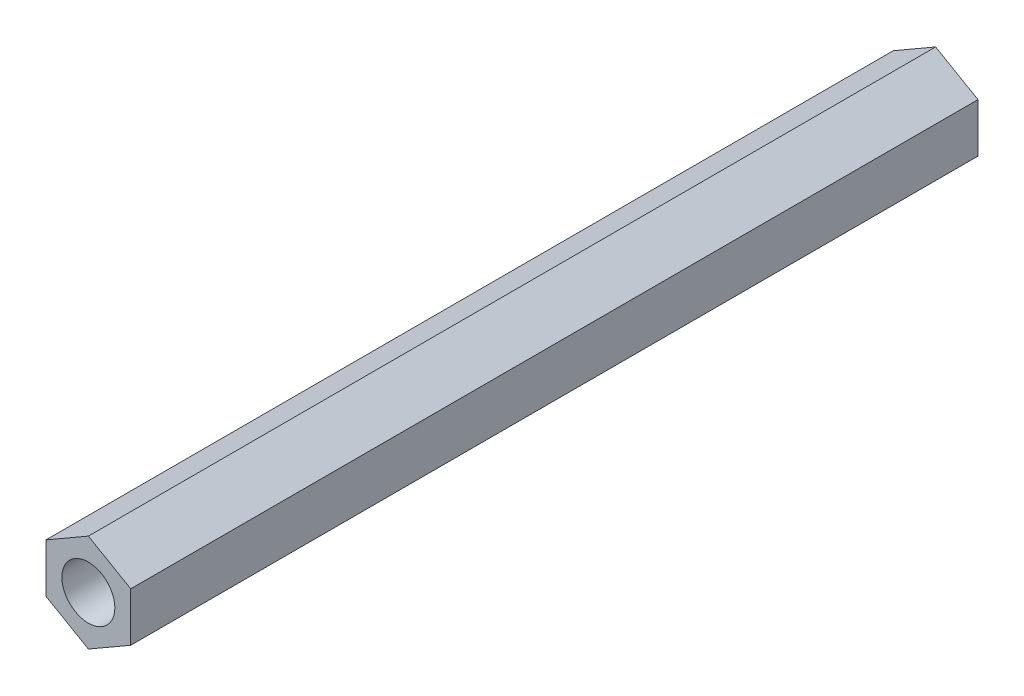
ISO-10303-21;
HEADER;
FILE_DESCRIPTION(('STEP AP214'),'2;1');
FILE_NAME('part.step','',(''),(''),'','','');
FILE_SCHEMA(('AUTOMOTIVE_DESIGN { 1 0 10303 214 1 1 1 1 }'));
ENDSEC;
DATA;
#1=APPLICATION_CONTEXT('core data for automotive mechanical design processes');
#2=APPLICATION_PROTOCOL_DEFINITION('international standard','automotive_design',2000,#1);
#3=PRODUCT_CONTEXT('',#1,'mechanical');
#4=PRODUCT('Part','Part','',(#3));
#5=PRODUCT_RELATED_PRODUCT_CATEGORY('part','',(#4));
#6=PRODUCT_DEFINITION_FORMATION('','',#4);
#7=PRODUCT_DEFINITION_CONTEXT('part definition',#1,'design');
#8=PRODUCT_DEFINITION('design','',#6,#7);
#9=PRODUCT_DEFINITION_SHAPE('','',#8);
#10=(LENGTH_UNIT() NAMED_UNIT(*) SI_UNIT(.MILLI.,.METRE.));
#11=(NAMED_UNIT(*) PLANE_ANGLE_UNIT() SI_UNIT($,.RADIAN.));
#12=(NAMED_UNIT(*) SI_UNIT($,.STERADIAN.) SOLID_ANGLE_UNIT());
#13=UNCERTAINTY_MEASURE_WITH_UNIT(LENGTH_MEASURE(1.E-05),#10,'distance_accuracy_value','');
#14=(GEOMETRIC_REPRESENTATION_CONTEXT(3) GLOBAL_UNCERTAINTY_ASSIGNED_CONTEXT((#13)) GLOBAL_UNIT_ASSIGNED_CONTEXT((#10,
#11,#12)) REPRESENTATION_CONTEXT('',''));
#15=CARTESIAN_POINT('',(0.,0.,0.));
#16=DIRECTION('',(0.,0.,1.));
#17=DIRECTION('',(1.,0.,0.));
#18=AXIS2_PLACEMENT_3D('',#15,#16,#17);
#19=CARTESIAN_POINT('',(0.,-4.61880215351701,80.));
#20=DIRECTION('',(-0.5,0.866025403784438,0.));
#21=DIRECTION('',(-0.866025403784438,-0.5,0.));
#22=AXIS2_PLACEMENT_3D('',#19,#20,#21);
#23=PLANE('',#22);
#24=DIRECTION('',(0.866025403784439,0.5,0.));
#25=VECTOR('',#24,1.);
#26=CARTESIAN_POINT('',(0.,-4.61880215351701,0.));
#27=LINE('',#26,#25);
#28=CARTESIAN_POINT('',(0.,-4.61880215351701,0.));
#29=VERTEX_POINT('',#28);
#30=CARTESIAN_POINT('',(4.,-2.3094010767585,0.));
#31=VERTEX_POINT('',#30);
#32=EDGE_CURVE('E127',#29,#31,#27,.T.);
#33=ORIENTED_EDGE('',*,*,#32,.T.);
#34=DIRECTION('',(0.,0.,-1.));
#35=VECTOR('',#34,1.);
#36=CARTESIAN_POINT('',(4.,-2.3094010767585,80.));
#37=LINE('',#36,#35);
#38=CARTESIAN_POINT('',(4.,-2.3094010767585,80.));
#39=VERTEX_POINT('',#38);
#40=EDGE_CURVE('E11',#39,#31,#37,.T.);
#41=ORIENTED_EDGE('',*,*,#40,.F.);
#42=DIRECTION('',(0.866025403784439,0.5,0.));
#43=VECTOR('',#42,1.);
#44=CARTESIAN_POINT('',(0.,-4.61880215351701,80.));
#45=LINE('',#44,#43);
#46=CARTESIAN_POINT('',(0.,-4.61880215351701,80.));
#47=VERTEX_POINT('',#46);
#48=EDGE_CURVE('E138',#47,#39,#45,.T.);
#49=ORIENTED_EDGE('',*,*,#48,.F.);
#50=DIRECTION('',(0.,0.,-1.));
#51=VECTOR('',#50,1.);
#52=CARTESIAN_POINT('',(0.,-4.61880215351701,80.));
#53=LINE('',#52,#51);
#54=EDGE_CURVE('E123',#47,#29,#53,.T.);
#55=ORIENTED_EDGE('',*,*,#54,.T.);
#56=EDGE_LOOP('',(#33,#41,#49,#55));
#57=FACE_BOUND('',#56,.T.);
#58=ADVANCED_FACE('F43',(#57),#23,.F.);
#59=CARTESIAN_POINT('',(4.,-2.3094010767585,80.));
#60=DIRECTION('',(-1.,0.,0.));
#61=DIRECTION('',(0.,-1.,0.));
#62=AXIS2_PLACEMENT_3D('',#59,#60,#61);
#63=PLANE('',#62);
#64=DIRECTION('',(0.,1.,0.));
#65=VECTOR('',#64,1.);
#66=CARTESIAN_POINT('',(4.,-2.3094010767585,0.));
#67=LINE('',#66,#65);
#68=CARTESIAN_POINT('',(4.,2.3094010767585,0.));
#69=VERTEX_POINT('',#68);
#70=EDGE_CURVE('E130',#31,#69,#67,.T.);
#71=ORIENTED_EDGE('',*,*,#70,.T.);
#72=DIRECTION('',(0.,0.,-1.));
#73=VECTOR('',#72,1.);
#74=CARTESIAN_POINT('',(4.,2.3094010767585,80.));
#75=LINE('',#74,#73);
#76=CARTESIAN_POINT('',(4.,2.3094010767585,80.));
#77=VERTEX_POINT('',#76);
#78=EDGE_CURVE('E51',#77,#69,#75,.T.);
#79=ORIENTED_EDGE('',*,*,#78,.F.);
#80=DIRECTION('',(0.,1.,0.));
#81=VECTOR('',#80,1.);
#82=CARTESIAN_POINT('',(4.,-2.3094010767585,80.));
#83=LINE('',#82,#81);
#84=EDGE_CURVE('E96',#39,#77,#83,.T.);
#85=ORIENTED_EDGE('',*,*,#84,.F.);
#86=ORIENTED_EDGE('',*,*,#40,.T.);
#87=EDGE_LOOP('',(#71,#79,#85,#86));
#88=FACE_BOUND('',#87,.T.);
#89=ADVANCED_FACE('F163',(#88),#63,.F.);
#90=CARTESIAN_POINT('',(4.,2.3094010767585,80.));
#91=DIRECTION('',(-0.5,-0.866025403784439,0.));
#92=DIRECTION('',(0.866025403784439,-0.5,0.));
#93=AXIS2_PLACEMENT_3D('',#90,#91,#92);
#94=PLANE('',#93);
#95=DIRECTION('',(-0.866025403784439,0.5,0.));
#96=VECTOR('',#95,1.);
#97=CARTESIAN_POINT('',(4.,2.3094010767585,0.));
#98=LINE('',#97,#96);
#99=CARTESIAN_POINT('',(0.,4.61880215351701,0.));
#100=VERTEX_POINT('',#99);
#101=EDGE_CURVE('E133',#69,#100,#98,.T.);
#102=ORIENTED_EDGE('',*,*,#101,.T.);
#103=DIRECTION('',(0.,0.,-1.));
#104=VECTOR('',#103,1.);
#105=CARTESIAN_POINT('',(0.,4.61880215351701,80.));
#106=LINE('',#105,#104);
#107=CARTESIAN_POINT('',(0.,4.61880215351701,80.));
#108=VERTEX_POINT('',#107);
#109=EDGE_CURVE('E118',#108,#100,#106,.T.);
#110=ORIENTED_EDGE('',*,*,#109,.F.);
#111=DIRECTION('',(-0.866025403784439,0.5,0.));
#112=VECTOR('',#111,1.);
#113=CARTESIAN_POINT('',(4.,2.3094010767585,80.));
#114=LINE('',#113,#112);
#115=EDGE_CURVE('E109',#77,#108,#114,.T.);
#116=ORIENTED_EDGE('',*,*,#115,.F.);
#117=ORIENTED_EDGE('',*,*,#78,.T.);
#118=EDGE_LOOP('',(#102,#110,#116,#117));
#119=FACE_BOUND('',#118,.T.);
#120=ADVANCED_FACE('F144',(#119),#94,.F.);
#121=CARTESIAN_POINT('',(0.,4.61880215351701,80.));
#122=DIRECTION('',(0.5,-0.866025403784439,0.));
#123=DIRECTION('',(0.866025403784439,0.5,0.));
#124=AXIS2_PLACEMENT_3D('',#121,#122,#123);
#125=PLANE('',#124);
#126=DIRECTION('',(-0.866025403784439,-0.5,0.));
#127=VECTOR('',#126,1.);
#128=CARTESIAN_POINT('',(0.,4.61880215351701,0.));
#129=LINE('',#128,#127);
#130=CARTESIAN_POINT('',(-4.,2.3094010767585,0.));
#131=VERTEX_POINT('',#130);
#132=EDGE_CURVE('E117',#100,#131,#129,.T.);
#133=ORIENTED_EDGE('',*,*,#132,.T.);
#134=DIRECTION('',(0.,0.,-1.));
#135=VECTOR('',#134,1.);
#136=CARTESIAN_POINT('',(-4.,2.3094010767585,80.));
#137=LINE('',#136,#135);
#138=CARTESIAN_POINT('',(-4.,2.3094010767585,80.));
#139=VERTEX_POINT('',#138);
#140=EDGE_CURVE('E114',#139,#131,#137,.T.);
#141=ORIENTED_EDGE('',*,*,#140,.F.);
#142=DIRECTION('',(-0.866025403784439,-0.5,0.));
#143=VECTOR('',#142,1.);
#144=CARTESIAN_POINT('',(0.,4.61880215351701,80.));
#145=LINE('',#144,#143);
#146=EDGE_CURVE('E103',#108,#139,#145,.T.);
#147=ORIENTED_EDGE('',*,*,#146,.F.);
#148=ORIENTED_EDGE('',*,*,#109,.T.);
#149=EDGE_LOOP('',(#133,#141,#147,#148));
#150=FACE_BOUND('',#149,.T.);
#151=ADVANCED_FACE('F115',(#150),#125,.F.);
#152=CARTESIAN_POINT('',(-4.,2.3094010767585,80.));
#153=DIRECTION('',(1.,0.,0.));
#154=DIRECTION('',(0.,0.,-1.));
#155=AXIS2_PLACEMENT_3D('',#152,#153,#154);
#156=PLANE('',#155);
#157=DIRECTION('',(0.,-1.,0.));
#158=VECTOR('',#157,1.);
#159=CARTESIAN_POINT('',(-4.,2.3094010767585,0.));
#160=LINE('',#159,#158);
#161=CARTESIAN_POINT('',(-4.,-2.3094010767585,0.));
#162=VERTEX_POINT('',#161);
#163=EDGE_CURVE('E82',#131,#162,#160,.T.);
#164=ORIENTED_EDGE('',*,*,#163,.T.);
#165=DIRECTION('',(0.,0.,-1.));
#166=VECTOR('',#165,1.);
#167=CARTESIAN_POINT('',(-4.,-2.3094010767585,80.));
#168=LINE('',#167,#166);
#169=CARTESIAN_POINT('',(-4.,-2.3094010767585,80.));
#170=VERTEX_POINT('',#169);
#171=EDGE_CURVE('E119',#170,#162,#168,.T.);
#172=ORIENTED_EDGE('',*,*,#171,.F.);
#173=DIRECTION('',(0.,-1.,0.));
#174=VECTOR('',#173,1.);
#175=CARTESIAN_POINT('',(-4.,2.3094010767585,80.));
#176=LINE('',#175,#174);
#177=EDGE_CURVE('E107',#139,#170,#176,.T.);
#178=ORIENTED_EDGE('',*,*,#177,.F.);
#179=ORIENTED_EDGE('',*,*,#140,.T.);
#180=EDGE_LOOP('',(#164,#172,#178,#179));
#181=FACE_BOUND('',#180,.T.);
#182=ADVANCED_FACE('F121',(#181),#156,.F.);
#183=CARTESIAN_POINT('',(-4.,-2.3094010767585,80.));
#184=DIRECTION('',(0.5,0.866025403784439,0.));
#185=DIRECTION('',(-0.866025403784439,0.5,0.));
#186=AXIS2_PLACEMENT_3D('',#183,#184,#185);
#187=PLANE('',#186);
#188=DIRECTION('',(0.866025403784439,-0.5,0.));
#189=VECTOR('',#188,1.);
#190=CARTESIAN_POINT('',(-4.,-2.3094010767585,0.));
#191=LINE('',#190,#189);
#192=EDGE_CURVE('E88',#162,#29,#191,.T.);
#193=ORIENTED_EDGE('',*,*,#192,.T.);
#194=ORIENTED_EDGE('',*,*,#54,.F.);
#195=DIRECTION('',(0.866025403784439,-0.5,0.));
#196=VECTOR('',#195,1.);
#197=CARTESIAN_POINT('',(-4.,-2.3094010767585,80.));
#198=LINE('',#197,#196);
#199=EDGE_CURVE('E59',#170,#47,#198,.T.);
#200=ORIENTED_EDGE('',*,*,#199,.F.);
#201=ORIENTED_EDGE('',*,*,#171,.T.);
#202=EDGE_LOOP('',(#193,#194,#200,#201));
#203=FACE_BOUND('',#202,.T.);
#204=ADVANCED_FACE('F151',(#203),#187,.F.);
#205=CARTESIAN_POINT('',(0.,0.,80.));
#206=DIRECTION('',(0.,0.,1.));
#207=DIRECTION('',(1.,0.,0.));
#208=AXIS2_PLACEMENT_3D('',#205,#206,#207);
#209=PLANE('',#208);
#210=CARTESIAN_POINT('',(0.,0.,80.));
#211=DIRECTION('',(0.,0.,1.));
#212=DIRECTION('',(1.,0.,0.));
#213=AXIS2_PLACEMENT_3D('',#210,#211,#212);
#214=CIRCLE('',#213,2.5);
#215=CARTESIAN_POINT('',(2.5,0.,80.));
#216=VERTEX_POINT('',#215);
#217=EDGE_CURVE('E221',#216,#216,#214,.T.);
#218=ORIENTED_EDGE('',*,*,#217,.F.);
#219=EDGE_LOOP('',(#218));
#220=FACE_BOUND('',#219,.T.);
#221=ORIENTED_EDGE('',*,*,#48,.T.);
#222=ORIENTED_EDGE('',*,*,#84,.T.);
#223=ORIENTED_EDGE('',*,*,#115,.T.);
#224=ORIENTED_EDGE('',*,*,#146,.T.);
#225=ORIENTED_EDGE('',*,*,#177,.T.);
#226=ORIENTED_EDGE('',*,*,#199,.T.);
#227=EDGE_LOOP('',(#221,#222,#223,#224,#225,#226));
#228=FACE_BOUND('',#227,.T.);
#229=ADVANCED_FACE('F105',(#220,#228),#209,.T.);
#230=CARTESIAN_POINT('',(0.,0.,0.));
#231=DIRECTION('',(0.,0.,1.));
#232=DIRECTION('',(1.,0.,0.));
#233=AXIS2_PLACEMENT_3D('',#230,#231,#232);
#234=PLANE('',#233);
#235=CARTESIAN_POINT('',(0.,0.,0.));
#236=DIRECTION('',(0.,0.,1.));
#237=DIRECTION('',(1.,0.,0.));
#238=AXIS2_PLACEMENT_3D('',#235,#236,#237);
#239=CIRCLE('',#238,2.5);
#240=CARTESIAN_POINT('',(2.5,0.,0.));
#241=VERTEX_POINT('',#240);
#242=EDGE_CURVE('E131',#241,#241,#239,.T.);
#243=ORIENTED_EDGE('',*,*,#242,.T.);
#244=EDGE_LOOP('',(#243));
#245=FACE_BOUND('',#244,.T.);
#246=ORIENTED_EDGE('',*,*,#32,.F.);
#247=ORIENTED_EDGE('',*,*,#192,.F.);
#248=ORIENTED_EDGE('',*,*,#163,.F.);
#249=ORIENTED_EDGE('',*,*,#132,.F.);
#250=ORIENTED_EDGE('',*,*,#101,.F.);
#251=ORIENTED_EDGE('',*,*,#70,.F.);
#252=EDGE_LOOP('',(#246,#247,#248,#249,#250,#251));
#253=FACE_BOUND('',#252,.T.);
#254=ADVANCED_FACE('F147',(#245,#253),#234,.F.);
#255=CARTESIAN_POINT('',(0.,0.,0.));
#256=DIRECTION('',(0.,0.,1.));
#257=DIRECTION('',(1.,0.,0.));
#258=AXIS2_PLACEMENT_3D('',#255,#256,#257);
#259=CYLINDRICAL_SURFACE('',#258,2.5);
#260=ORIENTED_EDGE('',*,*,#242,.F.);
#261=EDGE_LOOP('',(#260));
#262=FACE_BOUND('',#261,.T.);
#263=ORIENTED_EDGE('',*,*,#217,.T.);
#264=EDGE_LOOP('',(#263));
#265=FACE_BOUND('',#264,.T.);
#266=ADVANCED_FACE('F202',(#262,#265),#259,.F.);
#267=CLOSED_SHELL('',(#58,#89,#120,#151,#182,#204,#229,#254,#266));
#268=MANIFOLD_SOLID_BREP('B2',#267);
#269=ADVANCED_BREP_SHAPE_REPRESENTATION('',(#18,#268),#14);
#270=SHAPE_DEFINITION_REPRESENTATION(#9,#269);
ENDSEC;
END-ISO-10303-21;
